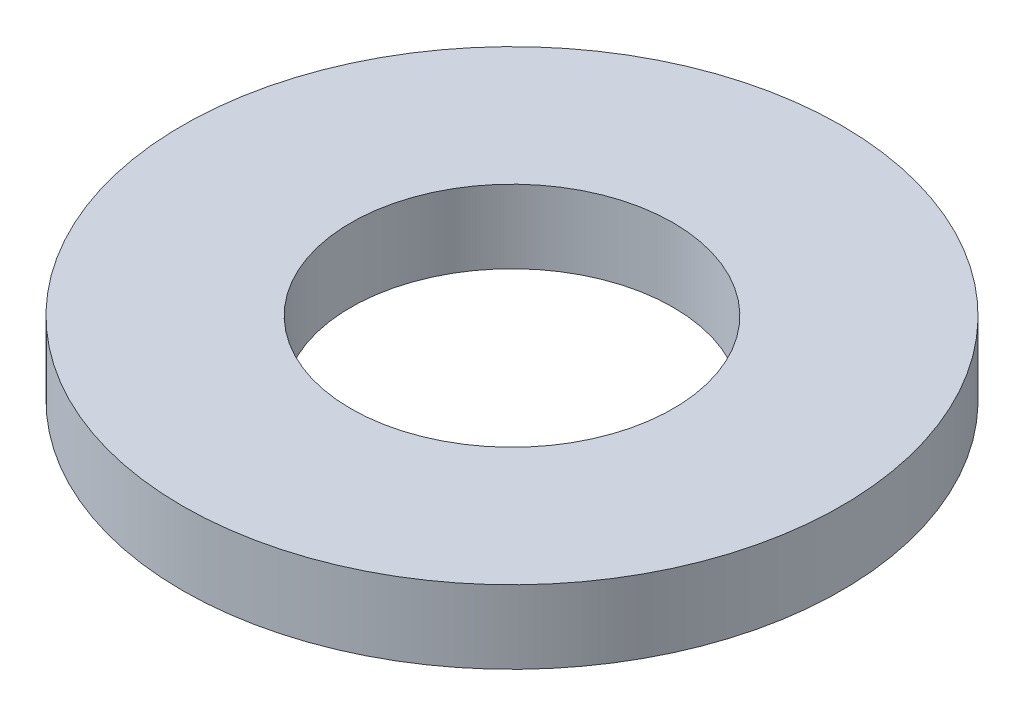
ISO-10303-21;
HEADER;
FILE_DESCRIPTION(('STEP AP214'),'2;1');
FILE_NAME('part.step','',(''),(''),'','','');
FILE_SCHEMA(('AUTOMOTIVE_DESIGN { 1 0 10303 214 1 1 1 1 }'));
ENDSEC;
DATA;
#1=APPLICATION_CONTEXT('core data for automotive mechanical design processes');
#2=APPLICATION_PROTOCOL_DEFINITION('international standard','automotive_design',2000,#1);
#3=PRODUCT_CONTEXT('',#1,'mechanical');
#4=PRODUCT('Part','Part','',(#3));
#5=PRODUCT_RELATED_PRODUCT_CATEGORY('part','',(#4));
#6=PRODUCT_DEFINITION_FORMATION('','',#4);
#7=PRODUCT_DEFINITION_CONTEXT('part definition',#1,'design');
#8=PRODUCT_DEFINITION('design','',#6,#7);
#9=PRODUCT_DEFINITION_SHAPE('','',#8);
#10=(LENGTH_UNIT() NAMED_UNIT(*) SI_UNIT(.MILLI.,.METRE.));
#11=(NAMED_UNIT(*) PLANE_ANGLE_UNIT() SI_UNIT($,.RADIAN.));
#12=(NAMED_UNIT(*) SI_UNIT($,.STERADIAN.) SOLID_ANGLE_UNIT());
#13=UNCERTAINTY_MEASURE_WITH_UNIT(LENGTH_MEASURE(1.E-05),#10,'distance_accuracy_value','');
#14=(GEOMETRIC_REPRESENTATION_CONTEXT(3) GLOBAL_UNCERTAINTY_ASSIGNED_CONTEXT((#13)) GLOBAL_UNIT_ASSIGNED_CONTEXT((#10,
#11,#12)) REPRESENTATION_CONTEXT('',''));
#15=CARTESIAN_POINT('',(0.,0.,0.));
#16=DIRECTION('',(0.,0.,1.));
#17=DIRECTION('',(1.,0.,0.));
#18=AXIS2_PLACEMENT_3D('',#15,#16,#17);
#19=CARTESIAN_POINT('',(0.,1.,0.));
#20=DIRECTION('',(0.,1.,0.));
#21=DIRECTION('',(0.,0.,1.));
#22=AXIS2_PLACEMENT_3D('',#19,#20,#21);
#23=PLANE('',#22);
#24=CARTESIAN_POINT('',(0.,1.,0.));
#25=DIRECTION('',(0.,1.,0.));
#26=DIRECTION('',(0.,0.,1.));
#27=AXIS2_PLACEMENT_3D('',#24,#25,#26);
#28=CIRCLE('',#27,4.5);
#29=CARTESIAN_POINT('',(0.,1.,4.5));
#30=VERTEX_POINT('',#29);
#31=EDGE_CURVE('E10',#30,#30,#28,.T.);
#32=ORIENTED_EDGE('',*,*,#31,.T.);
#33=EDGE_LOOP('',(#32));
#34=FACE_BOUND('',#33,.T.);
#35=CARTESIAN_POINT('',(0.,1.,0.));
#36=DIRECTION('',(0.,1.,0.));
#37=DIRECTION('',(0.,0.,1.));
#38=AXIS2_PLACEMENT_3D('',#35,#36,#37);
#39=CIRCLE('',#38,2.2);
#40=CARTESIAN_POINT('',(0.,1.,2.2));
#41=VERTEX_POINT('',#40);
#42=EDGE_CURVE('E49',#41,#41,#39,.T.);
#43=ORIENTED_EDGE('',*,*,#42,.F.);
#44=EDGE_LOOP('',(#43));
#45=FACE_BOUND('',#44,.T.);
#46=ADVANCED_FACE('F39',(#34,#45),#23,.T.);
#47=CARTESIAN_POINT('',(0.,0.,0.));
#48=DIRECTION('',(0.,1.,0.));
#49=DIRECTION('',(0.,0.,1.));
#50=AXIS2_PLACEMENT_3D('',#47,#48,#49);
#51=PLANE('',#50);
#52=CARTESIAN_POINT('',(0.,0.,0.));
#53=DIRECTION('',(0.,1.,0.));
#54=DIRECTION('',(0.,0.,1.));
#55=AXIS2_PLACEMENT_3D('',#52,#53,#54);
#56=CIRCLE('',#55,4.5);
#57=CARTESIAN_POINT('',(0.,0.,4.5));
#58=VERTEX_POINT('',#57);
#59=EDGE_CURVE('E43',#58,#58,#56,.T.);
#60=ORIENTED_EDGE('',*,*,#59,.F.);
#61=EDGE_LOOP('',(#60));
#62=FACE_BOUND('',#61,.T.);
#63=CARTESIAN_POINT('',(0.,0.,0.));
#64=DIRECTION('',(0.,1.,0.));
#65=DIRECTION('',(0.,0.,1.));
#66=AXIS2_PLACEMENT_3D('',#63,#64,#65);
#67=CIRCLE('',#66,2.2);
#68=CARTESIAN_POINT('',(0.,0.,2.2));
#69=VERTEX_POINT('',#68);
#70=EDGE_CURVE('E55',#69,#69,#67,.T.);
#71=ORIENTED_EDGE('',*,*,#70,.T.);
#72=EDGE_LOOP('',(#71));
#73=FACE_BOUND('',#72,.T.);
#74=ADVANCED_FACE('F65',(#62,#73),#51,.F.);
#75=CARTESIAN_POINT('',(0.,1.,0.));
#76=DIRECTION('',(0.,-1.,0.));
#77=DIRECTION('',(0.,0.,-1.));
#78=AXIS2_PLACEMENT_3D('',#75,#76,#77);
#79=CYLINDRICAL_SURFACE('',#78,4.5);
#80=ORIENTED_EDGE('',*,*,#31,.F.);
#81=EDGE_LOOP('',(#80));
#82=FACE_BOUND('',#81,.T.);
#83=ORIENTED_EDGE('',*,*,#59,.T.);
#84=EDGE_LOOP('',(#83));
#85=FACE_BOUND('',#84,.T.);
#86=ADVANCED_FACE('F41',(#82,#85),#79,.T.);
#87=CARTESIAN_POINT('',(0.,1.,0.));
#88=DIRECTION('',(0.,-1.,0.));
#89=DIRECTION('',(0.,0.,-1.));
#90=AXIS2_PLACEMENT_3D('',#87,#88,#89);
#91=CYLINDRICAL_SURFACE('',#90,2.2);
#92=ORIENTED_EDGE('',*,*,#42,.T.);
#93=EDGE_LOOP('',(#92));
#94=FACE_BOUND('',#93,.T.);
#95=ORIENTED_EDGE('',*,*,#70,.F.);
#96=EDGE_LOOP('',(#95));
#97=FACE_BOUND('',#96,.T.);
#98=ADVANCED_FACE('F59',(#94,#97),#91,.F.);
#99=CLOSED_SHELL('',(#46,#74,#86,#98));
#100=MANIFOLD_SOLID_BREP('B2',#99);
#101=ADVANCED_BREP_SHAPE_REPRESENTATION('',(#18,#100),#14);
#102=SHAPE_DEFINITION_REPRESENTATION(#9,#101);
ENDSEC;
END-ISO-10303-21;
